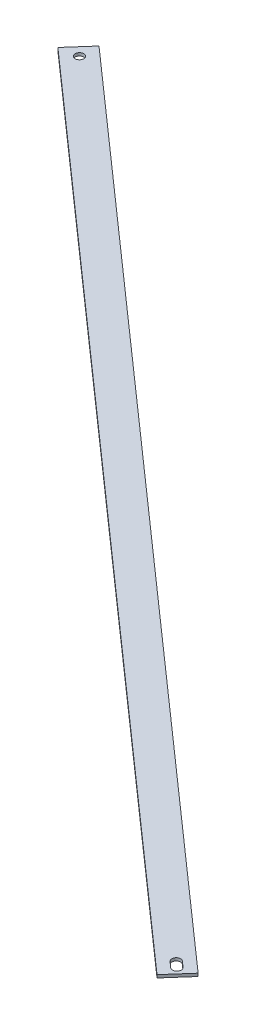
ISO-10303-21;
HEADER;
FILE_DESCRIPTION(('STEP AP214'),'2;1');
FILE_NAME('part.step','',(''),(''),'','','');
FILE_SCHEMA(('AUTOMOTIVE_DESIGN { 1 0 10303 214 1 1 1 1 }'));
ENDSEC;
DATA;
#1=APPLICATION_CONTEXT('core data for automotive mechanical design processes');
#2=APPLICATION_PROTOCOL_DEFINITION('international standard','automotive_design',2000,#1);
#3=PRODUCT_CONTEXT('',#1,'mechanical');
#4=PRODUCT('Part','Part','',(#3));
#5=PRODUCT_RELATED_PRODUCT_CATEGORY('part','',(#4));
#6=PRODUCT_DEFINITION_FORMATION('','',#4);
#7=PRODUCT_DEFINITION_CONTEXT('part definition',#1,'design');
#8=PRODUCT_DEFINITION('design','',#6,#7);
#9=PRODUCT_DEFINITION_SHAPE('','',#8);
#10=(LENGTH_UNIT() NAMED_UNIT(*) SI_UNIT(.MILLI.,.METRE.));
#11=(NAMED_UNIT(*) PLANE_ANGLE_UNIT() SI_UNIT($,.RADIAN.));
#12=(NAMED_UNIT(*) SI_UNIT($,.STERADIAN.) SOLID_ANGLE_UNIT());
#13=UNCERTAINTY_MEASURE_WITH_UNIT(LENGTH_MEASURE(1.E-05),#10,'distance_accuracy_value','');
#14=(GEOMETRIC_REPRESENTATION_CONTEXT(3) GLOBAL_UNCERTAINTY_ASSIGNED_CONTEXT((#13)) GLOBAL_UNIT_ASSIGNED_CONTEXT((#10,
#11,#12)) REPRESENTATION_CONTEXT('',''));
#15=CARTESIAN_POINT('',(0.,0.,0.));
#16=DIRECTION('',(0.,0.,1.));
#17=DIRECTION('',(1.,0.,0.));
#18=AXIS2_PLACEMENT_3D('',#15,#16,#17);
#19=CARTESIAN_POINT('',(19.865917921302,3.0031,-9.839877705531E-06));
#20=DIRECTION('',(0.,-1.,0.));
#21=DIRECTION('',(0.,0.,-1.));
#22=AXIS2_PLACEMENT_3D('',#19,#20,#21);
#23=PLANE('',#22);
#24=CARTESIAN_POINT('',(881.92221634192,3.0031,781.83509118588));
#25=DIRECTION('',(0.,1.,0.));
#26=DIRECTION('',(0.,0.,1.));
#27=AXIS2_PLACEMENT_3D('',#24,#25,#26);
#28=CIRCLE('',#27,4.5);
#29=CARTESIAN_POINT('',(884.90210642604,3.0031,778.46311030122));
#30=VERTEX_POINT('',#29);
#31=CARTESIAN_POINT('',(878.942326257799,3.0031,785.207072070546));
#32=VERTEX_POINT('',#31);
#33=EDGE_CURVE('E122',#30,#32,#28,.F.);
#34=ORIENTED_EDGE('',*,*,#33,.T.);
#35=DIRECTION('',(0.749329085480938,0.,0.662197796471946));
#36=VECTOR('',#35,1.);
#37=CARTESIAN_POINT('',(872.94769357395,3.0031,779.90948969877));
#38=LINE('',#37,#36);
#39=CARTESIAN_POINT('',(872.94769357395,3.0031,779.90948969877));
#40=VERTEX_POINT('',#39);
#41=EDGE_CURVE('E108',#32,#40,#38,.F.);
#42=ORIENTED_EDGE('',*,*,#41,.T.);
#43=CARTESIAN_POINT('',(875.92758365807,3.0031,776.53750881411));
#44=DIRECTION('',(0.,1.,0.));
#45=DIRECTION('',(0.,0.,1.));
#46=AXIS2_PLACEMENT_3D('',#43,#44,#45);
#47=CIRCLE('',#46,4.5);
#48=CARTESIAN_POINT('',(878.907473742191,3.0031,773.165527929443));
#49=VERTEX_POINT('',#48);
#50=EDGE_CURVE('E57',#40,#49,#47,.F.);
#51=ORIENTED_EDGE('',*,*,#50,.T.);
#52=DIRECTION('',(-0.749329085480938,0.,-0.662197796471946));
#53=VECTOR('',#52,1.);
#54=CARTESIAN_POINT('',(884.90210642604,3.0031,778.46311030122));
#55=LINE('',#54,#53);
#56=EDGE_CURVE('E103',#49,#30,#55,.F.);
#57=ORIENTED_EDGE('',*,*,#56,.T.);
#58=EDGE_LOOP('',(#34,#42,#51,#57));
#59=FACE_BOUND('',#58,.T.);
#60=CARTESIAN_POINT('',(18.9249,3.0031,19.1863));
#61=DIRECTION('',(0.,-1.,0.));
#62=DIRECTION('',(0.,0.,-1.));
#63=AXIS2_PLACEMENT_3D('',#60,#61,#62);
#64=CIRCLE('',#63,4.5);
#65=CARTESIAN_POINT('',(18.9249,3.0031,14.6863));
#66=VERTEX_POINT('',#65);
#67=EDGE_CURVE('E19',#66,#66,#64,.T.);
#68=ORIENTED_EDGE('',*,*,#67,.T.);
#69=EDGE_LOOP('',(#68));
#70=FACE_BOUND('',#69,.T.);
#71=DIRECTION('',(0.662197796471946,0.,-0.749329085480938));
#72=VECTOR('',#71,1.);
#73=CARTESIAN_POINT('',(897.84981597285,3.0031,775.89273727544));
#74=LINE('',#73,#72);
#75=CARTESIAN_POINT('',(897.849815972727,3.0031,775.892737275579));
#76=VERTEX_POINT('',#75);
#77=CARTESIAN_POINT('',(877.983882078629,3.0031,798.372609839939));
#78=VERTEX_POINT('',#77);
#79=EDGE_CURVE('E77',#76,#78,#74,.F.);
#80=ORIENTED_EDGE('',*,*,#79,.F.);
#81=DIRECTION('',(0.749329085480938,0.,0.662197796471946));
#82=VECTOR('',#81,1.);
#83=CARTESIAN_POINT('',(19.865917921302,3.0031,-9.839877705531E-06));
#84=LINE('',#83,#82);
#85=CARTESIAN_POINT('',(19.865917921302,3.0031,-9.83987770509176E-06));
#86=VERTEX_POINT('',#85);
#87=EDGE_CURVE('E75',#76,#86,#84,.F.);
#88=ORIENTED_EDGE('',*,*,#87,.T.);
#89=DIRECTION('',(0.662197796471946,0.,-0.749329085480938));
#90=VECTOR('',#89,1.);
#91=CARTESIAN_POINT('',(19.865917921302,3.0031,-9.839877705531E-06));
#92=LINE('',#91,#90);
#93=CARTESIAN_POINT('',(-1.59728511063704E-05,3.0031,22.4798627245555));
#94=VERTEX_POINT('',#93);
#95=EDGE_CURVE('E66',#86,#94,#92,.F.);
#96=ORIENTED_EDGE('',*,*,#95,.T.);
#97=DIRECTION('',(0.749329085480938,0.,0.662197796471946));
#98=VECTOR('',#97,1.);
#99=CARTESIAN_POINT('',(-1.597284940047E-05,3.0031,22.479862724557));
#100=LINE('',#99,#98);
#101=EDGE_CURVE('E135',#78,#94,#100,.F.);
#102=ORIENTED_EDGE('',*,*,#101,.F.);
#103=EDGE_LOOP('',(#80,#88,#96,#102));
#104=FACE_BOUND('',#103,.T.);
#105=ADVANCED_FACE('F16',(#59,#70,#104),#23,.F.);
#106=CARTESIAN_POINT('',(19.865917921302,3.0031,-9.839877705531E-06));
#107=DIRECTION('',(0.749329085480938,0.,0.662197796471946));
#108=DIRECTION('',(0.662197796471946,0.,-0.749329085480938));
#109=AXIS2_PLACEMENT_3D('',#106,#107,#108);
#110=PLANE('',#109);
#111=DIRECTION('',(0.,1.,0.));
#112=VECTOR('',#111,1.);
#113=CARTESIAN_POINT('',(-1.59728494047106E-05,3.0031,22.479862724557));
#114=LINE('',#113,#112);
#115=CARTESIAN_POINT('',(-1.5972852940709E-05,0.00309999999998951,22.4798627245539));
#116=VERTEX_POINT('',#115);
#117=EDGE_CURVE('E91',#94,#116,#114,.F.);
#118=ORIENTED_EDGE('',*,*,#117,.F.);
#119=ORIENTED_EDGE('',*,*,#95,.F.);
#120=DIRECTION('',(0.,1.,0.));
#121=VECTOR('',#120,1.);
#122=CARTESIAN_POINT('',(19.865917921302,3.0031,-9.839877705531E-06));
#123=LINE('',#122,#121);
#124=CARTESIAN_POINT('',(19.865917921302,0.00309999999998951,-9.83987770531138E-06));
#125=VERTEX_POINT('',#124);
#126=EDGE_CURVE('E82',#86,#125,#123,.F.);
#127=ORIENTED_EDGE('',*,*,#126,.T.);
#128=DIRECTION('',(0.662197796471707,0.,-0.749329085481149));
#129=VECTOR('',#128,1.);
#130=CARTESIAN_POINT('',(-1.59728494077138E-05,0.003099999999904,22.479862724557));
#131=LINE('',#130,#129);
#132=EDGE_CURVE('E106',#116,#125,#131,.T.);
#133=ORIENTED_EDGE('',*,*,#132,.F.);
#134=EDGE_LOOP('',(#118,#119,#127,#133));
#135=FACE_BOUND('',#134,.T.);
#136=ADVANCED_FACE('F86',(#135),#110,.F.);
#137=CARTESIAN_POINT('',(19.865917921302,3.0031,-9.839877705531E-06));
#138=DIRECTION('',(-0.662197796471946,0.,0.749329085480938));
#139=DIRECTION('',(0.749329085480938,0.,0.662197796471946));
#140=AXIS2_PLACEMENT_3D('',#137,#138,#139);
#141=PLANE('',#140);
#142=DIRECTION('',(0.749329085481148,0.,0.662197796471709));
#143=VECTOR('',#142,1.);
#144=CARTESIAN_POINT('',(19.865917921302,0.003099999999904,-9.839877705531E-06));
#145=LINE('',#144,#143);
#146=CARTESIAN_POINT('',(897.849815972727,0.00309999999998951,775.892737275579));
#147=VERTEX_POINT('',#146);
#148=EDGE_CURVE('E96',#125,#147,#145,.T.);
#149=ORIENTED_EDGE('',*,*,#148,.F.);
#150=ORIENTED_EDGE('',*,*,#126,.F.);
#151=ORIENTED_EDGE('',*,*,#87,.F.);
#152=DIRECTION('',(0.,1.,0.));
#153=VECTOR('',#152,1.);
#154=CARTESIAN_POINT('',(897.84981597285,3.0031,775.89273727544));
#155=LINE('',#154,#153);
#156=EDGE_CURVE('E98',#147,#76,#155,.T.);
#157=ORIENTED_EDGE('',*,*,#156,.F.);
#158=EDGE_LOOP('',(#149,#150,#151,#157));
#159=FACE_BOUND('',#158,.T.);
#160=ADVANCED_FACE('F94',(#159),#141,.F.);
#161=CARTESIAN_POINT('',(897.84981597285,3.0031,775.89273727544));
#162=DIRECTION('',(0.749329085480938,0.,0.662197796471946));
#163=DIRECTION('',(0.662197796471946,0.,-0.749329085480938));
#164=AXIS2_PLACEMENT_3D('',#161,#162,#163);
#165=PLANE('',#164);
#166=DIRECTION('',(0.,1.,0.));
#167=VECTOR('',#166,1.);
#168=CARTESIAN_POINT('',(877.983882078446,3.0031,798.372609840146));
#169=LINE('',#168,#167);
#170=CARTESIAN_POINT('',(877.983882078629,0.00309999999998951,798.372609839939));
#171=VERTEX_POINT('',#170);
#172=EDGE_CURVE('E127',#171,#78,#169,.T.);
#173=ORIENTED_EDGE('',*,*,#172,.F.);
#174=DIRECTION('',(-0.662197796471947,0.,0.749329085480937));
#175=VECTOR('',#174,1.);
#176=CARTESIAN_POINT('',(897.84981597285,0.003099999999904,775.89273727544));
#177=LINE('',#176,#175);
#178=EDGE_CURVE('E144',#147,#171,#177,.T.);
#179=ORIENTED_EDGE('',*,*,#178,.F.);
#180=ORIENTED_EDGE('',*,*,#156,.T.);
#181=ORIENTED_EDGE('',*,*,#79,.T.);
#182=EDGE_LOOP('',(#173,#179,#180,#181));
#183=FACE_BOUND('',#182,.T.);
#184=ADVANCED_FACE('F140',(#183),#165,.T.);
#185=CARTESIAN_POINT('',(-1.597284940047E-05,3.0031,22.479862724557));
#186=DIRECTION('',(-0.662197796471946,0.,0.749329085480938));
#187=DIRECTION('',(0.749329085480938,0.,0.662197796471946));
#188=AXIS2_PLACEMENT_3D('',#185,#186,#187);
#189=PLANE('',#188);
#190=DIRECTION('',(-0.749329085481147,0.,-0.66219779647171));
#191=VECTOR('',#190,1.);
#192=CARTESIAN_POINT('',(877.98388207869,0.003099999999904,798.37260983987));
#193=LINE('',#192,#191);
#194=EDGE_CURVE('E121',#171,#116,#193,.T.);
#195=ORIENTED_EDGE('',*,*,#194,.F.);
#196=ORIENTED_EDGE('',*,*,#172,.T.);
#197=ORIENTED_EDGE('',*,*,#101,.T.);
#198=ORIENTED_EDGE('',*,*,#117,.T.);
#199=EDGE_LOOP('',(#195,#196,#197,#198));
#200=FACE_BOUND('',#199,.T.);
#201=ADVANCED_FACE('F152',(#200),#189,.T.);
#202=CARTESIAN_POINT('',(18.9249,3.0031,19.1863));
#203=DIRECTION('',(0.,-1.,0.));
#204=DIRECTION('',(0.,0.,-1.));
#205=AXIS2_PLACEMENT_3D('',#202,#203,#204);
#206=CYLINDRICAL_SURFACE('',#205,4.5);
#207=ORIENTED_EDGE('',*,*,#67,.F.);
#208=EDGE_LOOP('',(#207));
#209=FACE_BOUND('',#208,.T.);
#210=CARTESIAN_POINT('',(18.9249,0.00310000000001802,19.1863));
#211=DIRECTION('',(0.,-1.,0.));
#212=DIRECTION('',(0.,0.,-1.));
#213=AXIS2_PLACEMENT_3D('',#210,#211,#212);
#214=CIRCLE('',#213,4.5);
#215=CARTESIAN_POINT('',(18.9249,0.00310000000001802,14.6863));
#216=VERTEX_POINT('',#215);
#217=EDGE_CURVE('E118',#216,#216,#214,.F.);
#218=ORIENTED_EDGE('',*,*,#217,.F.);
#219=EDGE_LOOP('',(#218));
#220=FACE_BOUND('',#219,.T.);
#221=ADVANCED_FACE('F192',(#209,#220),#206,.F.);
#222=CARTESIAN_POINT('',(875.92758365807,3.0031,776.53750881411));
#223=DIRECTION('',(0.,1.,0.));
#224=DIRECTION('',(0.,0.,1.));
#225=AXIS2_PLACEMENT_3D('',#222,#223,#224);
#226=CYLINDRICAL_SURFACE('',#225,4.5);
#227=DIRECTION('',(0.,1.,0.));
#228=VECTOR('',#227,1.);
#229=CARTESIAN_POINT('',(872.94769357395,3.0031,779.90948969877));
#230=LINE('',#229,#228);
#231=CARTESIAN_POINT('',(872.94769357395,0.00309999999996122,779.90948969877));
#232=VERTEX_POINT('',#231);
#233=EDGE_CURVE('E111',#40,#232,#230,.F.);
#234=ORIENTED_EDGE('',*,*,#233,.T.);
#235=CARTESIAN_POINT('',(875.92758365807,0.00310000000001802,776.53750881411));
#236=DIRECTION('',(0.,1.,0.));
#237=DIRECTION('',(0.,0.,1.));
#238=AXIS2_PLACEMENT_3D('',#235,#236,#237);
#239=CIRCLE('',#238,4.5);
#240=CARTESIAN_POINT('',(878.907473742192,0.00310000000001802,773.165527929443));
#241=VERTEX_POINT('',#240);
#242=EDGE_CURVE('E115',#241,#232,#239,.T.);
#243=ORIENTED_EDGE('',*,*,#242,.F.);
#244=DIRECTION('',(0.,1.,0.));
#245=VECTOR('',#244,1.);
#246=CARTESIAN_POINT('',(878.907473742189,3.0031,773.165527929441));
#247=LINE('',#246,#245);
#248=EDGE_CURVE('E107',#241,#49,#247,.T.);
#249=ORIENTED_EDGE('',*,*,#248,.T.);
#250=ORIENTED_EDGE('',*,*,#50,.F.);
#251=EDGE_LOOP('',(#234,#243,#249,#250));
#252=FACE_BOUND('',#251,.T.);
#253=ADVANCED_FACE('F170',(#252),#226,.F.);
#254=CARTESIAN_POINT('',(872.94769357395,3.0031,779.90948969877));
#255=DIRECTION('',(-0.662197796471946,0.,0.749329085480938));
#256=DIRECTION('',(0.749329085480938,0.,0.662197796471946));
#257=AXIS2_PLACEMENT_3D('',#254,#255,#256);
#258=PLANE('',#257);
#259=DIRECTION('',(0.,1.,0.));
#260=VECTOR('',#259,1.);
#261=CARTESIAN_POINT('',(878.942326257801,3.0031,785.207072070549));
#262=LINE('',#261,#260);
#263=CARTESIAN_POINT('',(878.942326257798,0.00310000000001802,785.207072070547));
#264=VERTEX_POINT('',#263);
#265=EDGE_CURVE('E110',#32,#264,#262,.F.);
#266=ORIENTED_EDGE('',*,*,#265,.T.);
#267=DIRECTION('',(0.749329085480808,0.,0.662197796472094));
#268=VECTOR('',#267,1.);
#269=CARTESIAN_POINT('',(872.94769357395,0.003099999999904,779.90948969877));
#270=LINE('',#269,#268);
#271=EDGE_CURVE('E114',#232,#264,#270,.T.);
#272=ORIENTED_EDGE('',*,*,#271,.F.);
#273=ORIENTED_EDGE('',*,*,#233,.F.);
#274=ORIENTED_EDGE('',*,*,#41,.F.);
#275=EDGE_LOOP('',(#266,#272,#273,#274));
#276=FACE_BOUND('',#275,.T.);
#277=ADVANCED_FACE('F163',(#276),#258,.F.);
#278=CARTESIAN_POINT('',(881.92221634192,3.0031,781.83509118588));
#279=DIRECTION('',(0.,1.,0.));
#280=DIRECTION('',(0.,0.,1.));
#281=AXIS2_PLACEMENT_3D('',#278,#279,#280);
#282=CYLINDRICAL_SURFACE('',#281,4.5);
#283=DIRECTION('',(0.,1.,0.));
#284=VECTOR('',#283,1.);
#285=CARTESIAN_POINT('',(884.90210642604,3.0031,778.46311030122));
#286=LINE('',#285,#284);
#287=CARTESIAN_POINT('',(884.90210642604,0.00309999999996078,778.46311030122));
#288=VERTEX_POINT('',#287);
#289=EDGE_CURVE('E34',#30,#288,#286,.F.);
#290=ORIENTED_EDGE('',*,*,#289,.T.);
#291=CARTESIAN_POINT('',(881.92221634192,0.00310000000001802,781.83509118588));
#292=DIRECTION('',(0.,1.,0.));
#293=DIRECTION('',(0.,0.,1.));
#294=AXIS2_PLACEMENT_3D('',#291,#292,#293);
#295=CIRCLE('',#294,4.5);
#296=EDGE_CURVE('E25',#264,#288,#295,.T.);
#297=ORIENTED_EDGE('',*,*,#296,.F.);
#298=ORIENTED_EDGE('',*,*,#265,.F.);
#299=ORIENTED_EDGE('',*,*,#33,.F.);
#300=EDGE_LOOP('',(#290,#297,#298,#299));
#301=FACE_BOUND('',#300,.T.);
#302=ADVANCED_FACE('F166',(#301),#282,.F.);
#303=CARTESIAN_POINT('',(884.90210642604,3.0031,778.46311030122));
#304=DIRECTION('',(0.662197796471946,0.,-0.749329085480938));
#305=DIRECTION('',(-0.749329085480938,0.,-0.662197796471946));
#306=AXIS2_PLACEMENT_3D('',#303,#304,#305);
#307=PLANE('',#306);
#308=ORIENTED_EDGE('',*,*,#248,.F.);
#309=DIRECTION('',(-0.749329085480801,0.,-0.662197796472102));
#310=VECTOR('',#309,1.);
#311=CARTESIAN_POINT('',(884.90210642604,0.003099999999904,778.46311030122));
#312=LINE('',#311,#310);
#313=EDGE_CURVE('E11',#288,#241,#312,.T.);
#314=ORIENTED_EDGE('',*,*,#313,.F.);
#315=ORIENTED_EDGE('',*,*,#289,.F.);
#316=ORIENTED_EDGE('',*,*,#56,.F.);
#317=EDGE_LOOP('',(#308,#314,#315,#316));
#318=FACE_BOUND('',#317,.T.);
#319=ADVANCED_FACE('F173',(#318),#307,.F.);
#320=CARTESIAN_POINT('',(19.865917921302,0.003099999999904,-9.839877705531E-06));
#321=DIRECTION('',(0.,-1.,0.));
#322=DIRECTION('',(0.,0.,-1.));
#323=AXIS2_PLACEMENT_3D('',#320,#321,#322);
#324=PLANE('',#323);
#325=ORIENTED_EDGE('',*,*,#296,.T.);
#326=ORIENTED_EDGE('',*,*,#313,.T.);
#327=ORIENTED_EDGE('',*,*,#242,.T.);
#328=ORIENTED_EDGE('',*,*,#271,.T.);
#329=EDGE_LOOP('',(#325,#326,#327,#328));
#330=FACE_BOUND('',#329,.T.);
#331=ORIENTED_EDGE('',*,*,#217,.T.);
#332=EDGE_LOOP('',(#331));
#333=FACE_BOUND('',#332,.T.);
#334=ORIENTED_EDGE('',*,*,#178,.T.);
#335=ORIENTED_EDGE('',*,*,#194,.T.);
#336=ORIENTED_EDGE('',*,*,#132,.T.);
#337=ORIENTED_EDGE('',*,*,#148,.T.);
#338=EDGE_LOOP('',(#334,#335,#336,#337));
#339=FACE_BOUND('',#338,.T.);
#340=ADVANCED_FACE('F153',(#330,#333,#339),#324,.T.);
#341=CLOSED_SHELL('',(#105,#136,#160,#184,#201,#221,#253,#277,#302,#319,#340));
#342=MANIFOLD_SOLID_BREP('B1',#341);
#343=ADVANCED_BREP_SHAPE_REPRESENTATION('',(#18,#342),#14);
#344=SHAPE_DEFINITION_REPRESENTATION(#9,#343);
ENDSEC;
END-ISO-10303-21;
